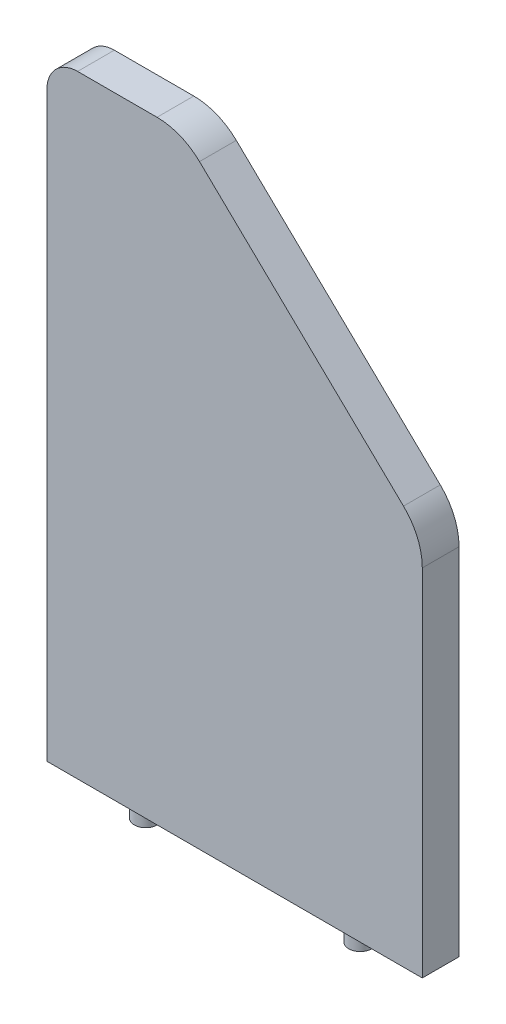
ISO-10303-21;
HEADER;
FILE_DESCRIPTION(('STEP AP214'),'2;1');
FILE_NAME('part.step','',(''),(''),'','','');
FILE_SCHEMA(('AUTOMOTIVE_DESIGN { 1 0 10303 214 1 1 1 1 }'));
ENDSEC;
DATA;
#1=APPLICATION_CONTEXT('core data for automotive mechanical design processes');
#2=APPLICATION_PROTOCOL_DEFINITION('international standard','automotive_design',2000,#1);
#3=PRODUCT_CONTEXT('',#1,'mechanical');
#4=PRODUCT('Part','Part','',(#3));
#5=PRODUCT_RELATED_PRODUCT_CATEGORY('part','',(#4));
#6=PRODUCT_DEFINITION_FORMATION('','',#4);
#7=PRODUCT_DEFINITION_CONTEXT('part definition',#1,'design');
#8=PRODUCT_DEFINITION('design','',#6,#7);
#9=PRODUCT_DEFINITION_SHAPE('','',#8);
#10=(LENGTH_UNIT() NAMED_UNIT(*) SI_UNIT(.MILLI.,.METRE.));
#11=(NAMED_UNIT(*) PLANE_ANGLE_UNIT() SI_UNIT($,.RADIAN.));
#12=(NAMED_UNIT(*) SI_UNIT($,.STERADIAN.) SOLID_ANGLE_UNIT());
#13=UNCERTAINTY_MEASURE_WITH_UNIT(LENGTH_MEASURE(1.E-05),#10,'distance_accuracy_value','');
#14=(GEOMETRIC_REPRESENTATION_CONTEXT(3) GLOBAL_UNCERTAINTY_ASSIGNED_CONTEXT((#13)) GLOBAL_UNIT_ASSIGNED_CONTEXT((#10,
#11,#12)) REPRESENTATION_CONTEXT('',''));
#15=CARTESIAN_POINT('',(0.,0.,0.));
#16=DIRECTION('',(0.,0.,1.));
#17=DIRECTION('',(1.,0.,0.));
#18=AXIS2_PLACEMENT_3D('',#15,#16,#17);
#19=CARTESIAN_POINT('',(0.,0.,12.));
#20=DIRECTION('',(0.,1.,0.));
#21=DIRECTION('',(0.,0.,1.));
#22=AXIS2_PLACEMENT_3D('',#19,#20,#21);
#23=PLANE('',#22);
#24=CARTESIAN_POINT('',(26.25,0.,6.));
#25=DIRECTION('',(0.,1.,0.));
#26=DIRECTION('',(0.,0.,1.));
#27=AXIS2_PLACEMENT_3D('',#24,#25,#26);
#28=CIRCLE('',#27,3.75);
#29=CARTESIAN_POINT('',(26.25,0.,9.75));
#30=VERTEX_POINT('',#29);
#31=EDGE_CURVE('E41',#30,#30,#28,.F.);
#32=ORIENTED_EDGE('',*,*,#31,.F.);
#33=EDGE_LOOP('',(#32));
#34=FACE_BOUND('',#33,.T.);
#35=DIRECTION('',(1.,0.,0.));
#36=VECTOR('',#35,1.);
#37=CARTESIAN_POINT('',(0.,0.,0.));
#38=LINE('',#37,#36);
#39=CARTESIAN_POINT('',(0.,0.,0.));
#40=VERTEX_POINT('',#39);
#41=CARTESIAN_POINT('',(122.5,0.,0.));
#42=VERTEX_POINT('',#41);
#43=EDGE_CURVE('E156',#40,#42,#38,.T.);
#44=ORIENTED_EDGE('',*,*,#43,.T.);
#45=DIRECTION('',(0.,0.,-1.));
#46=VECTOR('',#45,1.);
#47=CARTESIAN_POINT('',(122.5,0.,12.));
#48=LINE('',#47,#46);
#49=CARTESIAN_POINT('',(122.5,0.,12.));
#50=VERTEX_POINT('',#49);
#51=EDGE_CURVE('E154',#50,#42,#48,.T.);
#52=ORIENTED_EDGE('',*,*,#51,.F.);
#53=DIRECTION('',(1.,0.,0.));
#54=VECTOR('',#53,1.);
#55=CARTESIAN_POINT('',(0.,0.,12.));
#56=LINE('',#55,#54);
#57=CARTESIAN_POINT('',(0.,0.,12.));
#58=VERTEX_POINT('',#57);
#59=EDGE_CURVE('E146',#58,#50,#56,.T.);
#60=ORIENTED_EDGE('',*,*,#59,.F.);
#61=DIRECTION('',(0.,0.,-1.));
#62=VECTOR('',#61,1.);
#63=CARTESIAN_POINT('',(0.,0.,12.));
#64=LINE('',#63,#62);
#65=EDGE_CURVE('E164',#58,#40,#64,.T.);
#66=ORIENTED_EDGE('',*,*,#65,.T.);
#67=EDGE_LOOP('',(#44,#52,#60,#66));
#68=FACE_BOUND('',#67,.T.);
#69=CARTESIAN_POINT('',(96.25,0.,6.));
#70=DIRECTION('',(0.,1.,0.));
#71=DIRECTION('',(0.,0.,1.));
#72=AXIS2_PLACEMENT_3D('',#69,#70,#71);
#73=CIRCLE('',#72,3.75000000000001);
#74=CARTESIAN_POINT('',(96.25,0.,9.75000000000001));
#75=VERTEX_POINT('',#74);
#76=EDGE_CURVE('E11',#75,#75,#73,.F.);
#77=ORIENTED_EDGE('',*,*,#76,.F.);
#78=EDGE_LOOP('',(#77));
#79=FACE_BOUND('',#78,.T.);
#80=ADVANCED_FACE('F33',(#34,#68,#79),#23,.F.);
#81=CARTESIAN_POINT('',(0.,0.,12.));
#82=DIRECTION('',(1.,0.,0.));
#83=DIRECTION('',(0.,0.,-1.));
#84=AXIS2_PLACEMENT_3D('',#81,#82,#83);
#85=PLANE('',#84);
#86=CARTESIAN_POINT('',(0.,10.,6.));
#87=DIRECTION('',(-1.,0.,0.));
#88=DIRECTION('',(0.,0.,1.));
#89=AXIS2_PLACEMENT_3D('',#86,#87,#88);
#90=CIRCLE('',#89,2.49999999999999);
#91=CARTESIAN_POINT('',(0.,10.,8.49999999999999));
#92=VERTEX_POINT('',#91);
#93=EDGE_CURVE('E121',#92,#92,#90,.T.);
#94=ORIENTED_EDGE('',*,*,#93,.F.);
#95=EDGE_LOOP('',(#94));
#96=FACE_BOUND('',#95,.T.);
#97=CARTESIAN_POINT('',(0.,180.,6.));
#98=DIRECTION('',(-1.,0.,0.));
#99=DIRECTION('',(0.,0.,1.));
#100=AXIS2_PLACEMENT_3D('',#97,#98,#99);
#101=CIRCLE('',#100,2.5);
#102=CARTESIAN_POINT('',(0.,180.,8.5));
#103=VERTEX_POINT('',#102);
#104=EDGE_CURVE('E120',#103,#103,#101,.T.);
#105=ORIENTED_EDGE('',*,*,#104,.F.);
#106=EDGE_LOOP('',(#105));
#107=FACE_BOUND('',#106,.T.);
#108=DIRECTION('',(0.,-1.,0.));
#109=VECTOR('',#108,1.);
#110=CARTESIAN_POINT('',(0.,0.,12.));
#111=LINE('',#110,#109);
#112=CARTESIAN_POINT('',(0.,190.,12.));
#113=VERTEX_POINT('',#112);
#114=EDGE_CURVE('E144',#113,#58,#111,.T.);
#115=ORIENTED_EDGE('',*,*,#114,.F.);
#116=DIRECTION('',(0.,0.,-1.));
#117=VECTOR('',#116,1.);
#118=CARTESIAN_POINT('',(0.,190.,12.));
#119=LINE('',#118,#117);
#120=CARTESIAN_POINT('',(0.,190.,0.));
#121=VERTEX_POINT('',#120);
#122=EDGE_CURVE('E185',#113,#121,#119,.T.);
#123=ORIENTED_EDGE('',*,*,#122,.T.);
#124=DIRECTION('',(0.,-1.,0.));
#125=VECTOR('',#124,1.);
#126=CARTESIAN_POINT('',(0.,0.,0.));
#127=LINE('',#126,#125);
#128=EDGE_CURVE('E141',#121,#40,#127,.T.);
#129=ORIENTED_EDGE('',*,*,#128,.T.);
#130=ORIENTED_EDGE('',*,*,#65,.F.);
#131=EDGE_LOOP('',(#115,#123,#129,#130));
#132=FACE_BOUND('',#131,.T.);
#133=ADVANCED_FACE('F198',(#96,#107,#132),#85,.F.);
#134=CARTESIAN_POINT('',(122.5,0.,12.));
#135=DIRECTION('',(-1.,0.,0.));
#136=DIRECTION('',(0.,0.,1.));
#137=AXIS2_PLACEMENT_3D('',#134,#135,#136);
#138=PLANE('',#137);
#139=DIRECTION('',(0.,1.,0.));
#140=VECTOR('',#139,1.);
#141=CARTESIAN_POINT('',(122.5,0.,0.));
#142=LINE('',#141,#140);
#143=CARTESIAN_POINT('',(122.5,115.907902457887,0.));
#144=VERTEX_POINT('',#143);
#145=EDGE_CURVE('E158',#42,#144,#142,.T.);
#146=ORIENTED_EDGE('',*,*,#145,.T.);
#147=DIRECTION('',(0.,0.,1.));
#148=VECTOR('',#147,1.);
#149=CARTESIAN_POINT('',(122.5,115.907902457887,12.));
#150=LINE('',#149,#148);
#151=CARTESIAN_POINT('',(122.5,115.907902457887,12.));
#152=VERTEX_POINT('',#151);
#153=EDGE_CURVE('E176',#144,#152,#150,.T.);
#154=ORIENTED_EDGE('',*,*,#153,.T.);
#155=DIRECTION('',(0.,1.,0.));
#156=VECTOR('',#155,1.);
#157=CARTESIAN_POINT('',(122.5,0.,12.));
#158=LINE('',#157,#156);
#159=EDGE_CURVE('E149',#50,#152,#158,.T.);
#160=ORIENTED_EDGE('',*,*,#159,.F.);
#161=ORIENTED_EDGE('',*,*,#51,.T.);
#162=EDGE_LOOP('',(#146,#154,#160,#161));
#163=FACE_BOUND('',#162,.T.);
#164=ADVANCED_FACE('F237',(#163),#138,.F.);
#165=CARTESIAN_POINT('',(0.,200.,12.));
#166=DIRECTION('',(0.,-1.,0.));
#167=DIRECTION('',(0.,0.,-1.));
#168=AXIS2_PLACEMENT_3D('',#165,#166,#167);
#169=PLANE('',#168);
#170=DIRECTION('',(-1.,0.,0.));
#171=VECTOR('',#170,1.);
#172=CARTESIAN_POINT('',(0.,200.,0.));
#173=LINE('',#172,#171);
#174=CARTESIAN_POINT('',(35.9233922790321,200.,0.));
#175=VERTEX_POINT('',#174);
#176=CARTESIAN_POINT('',(10.,200.,0.));
#177=VERTEX_POINT('',#176);
#178=EDGE_CURVE('E147',#175,#177,#173,.T.);
#179=ORIENTED_EDGE('',*,*,#178,.T.);
#180=DIRECTION('',(0.,0.,-1.));
#181=VECTOR('',#180,1.);
#182=CARTESIAN_POINT('',(10.,200.,12.));
#183=LINE('',#182,#181);
#184=CARTESIAN_POINT('',(10.,200.,12.));
#185=VERTEX_POINT('',#184);
#186=EDGE_CURVE('E48',#177,#185,#183,.F.);
#187=ORIENTED_EDGE('',*,*,#186,.T.);
#188=DIRECTION('',(-1.,0.,0.));
#189=VECTOR('',#188,1.);
#190=CARTESIAN_POINT('',(0.,200.,12.));
#191=LINE('',#190,#189);
#192=CARTESIAN_POINT('',(35.9233922790321,200.,12.));
#193=VERTEX_POINT('',#192);
#194=EDGE_CURVE('E152',#193,#185,#191,.T.);
#195=ORIENTED_EDGE('',*,*,#194,.F.);
#196=DIRECTION('',(0.,0.,1.));
#197=VECTOR('',#196,1.);
#198=CARTESIAN_POINT('',(35.9233922790321,200.,12.));
#199=LINE('',#198,#197);
#200=EDGE_CURVE('E172',#193,#175,#199,.F.);
#201=ORIENTED_EDGE('',*,*,#200,.T.);
#202=EDGE_LOOP('',(#179,#187,#195,#201));
#203=FACE_BOUND('',#202,.T.);
#204=ADVANCED_FACE('F231',(#203),#169,.F.);
#205=CARTESIAN_POINT('',(0.,0.,12.));
#206=DIRECTION('',(0.,0.,-1.));
#207=DIRECTION('',(-1.,0.,0.));
#208=AXIS2_PLACEMENT_3D('',#205,#206,#207);
#209=PLANE('',#208);
#210=ORIENTED_EDGE('',*,*,#194,.T.);
#211=CARTESIAN_POINT('',(10.,190.,12.));
#212=DIRECTION('',(0.,0.,-1.));
#213=DIRECTION('',(-1.,0.,0.));
#214=AXIS2_PLACEMENT_3D('',#211,#212,#213);
#215=CIRCLE('',#214,10.);
#216=EDGE_CURVE('E190',#185,#113,#215,.F.);
#217=ORIENTED_EDGE('',*,*,#216,.T.);
#218=ORIENTED_EDGE('',*,*,#114,.T.);
#219=ORIENTED_EDGE('',*,*,#59,.T.);
#220=ORIENTED_EDGE('',*,*,#159,.T.);
#221=CARTESIAN_POINT('',(102.5,115.907902457887,12.));
#222=DIRECTION('',(0.,0.,-1.));
#223=DIRECTION('',(-1.,0.,0.));
#224=AXIS2_PLACEMENT_3D('',#221,#222,#223);
#225=CIRCLE('',#224,20.);
#226=CARTESIAN_POINT('',(116.370732635551,130.316329719496,12.));
#227=VERTEX_POINT('',#226);
#228=EDGE_CURVE('E179',#152,#227,#225,.F.);
#229=ORIENTED_EDGE('',*,*,#228,.T.);
#230=DIRECTION('',(0.720421363080441,-0.693536631777528,0.));
#231=VECTOR('',#230,1.);
#232=CARTESIAN_POINT('',(43.9857966023049,200.,12.));
#233=LINE('',#232,#231);
#234=CARTESIAN_POINT('',(49.7941249145827,194.408427261609,12.));
#235=VERTEX_POINT('',#234);
#236=EDGE_CURVE('E137',#235,#227,#233,.T.);
#237=ORIENTED_EDGE('',*,*,#236,.F.);
#238=CARTESIAN_POINT('',(35.9233922790321,180.,12.));
#239=DIRECTION('',(0.,0.,-1.));
#240=DIRECTION('',(-1.,0.,0.));
#241=AXIS2_PLACEMENT_3D('',#238,#239,#240);
#242=CIRCLE('',#241,20.);
#243=EDGE_CURVE('E170',#235,#193,#242,.F.);
#244=ORIENTED_EDGE('',*,*,#243,.T.);
#245=EDGE_LOOP('',(#210,#217,#218,#219,#220,#229,#237,#244));
#246=FACE_BOUND('',#245,.T.);
#247=ADVANCED_FACE('F228',(#246),#209,.F.);
#248=CARTESIAN_POINT('',(0.,0.,0.));
#249=DIRECTION('',(0.,0.,-1.));
#250=DIRECTION('',(-1.,0.,0.));
#251=AXIS2_PLACEMENT_3D('',#248,#249,#250);
#252=PLANE('',#251);
#253=ORIENTED_EDGE('',*,*,#128,.F.);
#254=CARTESIAN_POINT('',(10.,190.,0.));
#255=DIRECTION('',(0.,0.,-1.));
#256=DIRECTION('',(-1.,0.,0.));
#257=AXIS2_PLACEMENT_3D('',#254,#255,#256);
#258=CIRCLE('',#257,10.);
#259=EDGE_CURVE('E56',#121,#177,#258,.T.);
#260=ORIENTED_EDGE('',*,*,#259,.T.);
#261=ORIENTED_EDGE('',*,*,#178,.F.);
#262=CARTESIAN_POINT('',(35.9233922790321,180.,0.));
#263=DIRECTION('',(0.,0.,-1.));
#264=DIRECTION('',(-1.,0.,0.));
#265=AXIS2_PLACEMENT_3D('',#262,#263,#264);
#266=CIRCLE('',#265,20.);
#267=CARTESIAN_POINT('',(49.7941249145827,194.408427261609,0.));
#268=VERTEX_POINT('',#267);
#269=EDGE_CURVE('E174',#175,#268,#266,.T.);
#270=ORIENTED_EDGE('',*,*,#269,.T.);
#271=DIRECTION('',(0.720421363080441,-0.693536631777528,0.));
#272=VECTOR('',#271,1.);
#273=CARTESIAN_POINT('',(43.9857966023049,200.,0.));
#274=LINE('',#273,#272);
#275=CARTESIAN_POINT('',(116.370732635551,130.316329719496,0.));
#276=VERTEX_POINT('',#275);
#277=EDGE_CURVE('E138',#268,#276,#274,.T.);
#278=ORIENTED_EDGE('',*,*,#277,.T.);
#279=CARTESIAN_POINT('',(102.5,115.907902457887,0.));
#280=DIRECTION('',(0.,0.,-1.));
#281=DIRECTION('',(-1.,0.,0.));
#282=AXIS2_PLACEMENT_3D('',#279,#280,#281);
#283=CIRCLE('',#282,20.);
#284=EDGE_CURVE('E183',#276,#144,#283,.T.);
#285=ORIENTED_EDGE('',*,*,#284,.T.);
#286=ORIENTED_EDGE('',*,*,#145,.F.);
#287=ORIENTED_EDGE('',*,*,#43,.F.);
#288=EDGE_LOOP('',(#253,#260,#261,#270,#278,#285,#286,#287));
#289=FACE_BOUND('',#288,.T.);
#290=ADVANCED_FACE('F226',(#289),#252,.T.);
#291=CARTESIAN_POINT('',(43.9857966023049,200.,0.));
#292=DIRECTION('',(-0.693536631777528,-0.720421363080441,0.));
#293=DIRECTION('',(0.720421363080441,-0.693536631777528,0.));
#294=AXIS2_PLACEMENT_3D('',#291,#292,#293);
#295=PLANE('',#294);
#296=ORIENTED_EDGE('',*,*,#236,.T.);
#297=DIRECTION('',(0.,0.,1.));
#298=VECTOR('',#297,1.);
#299=CARTESIAN_POINT('',(116.370732635551,130.316329719496,0.));
#300=LINE('',#299,#298);
#301=EDGE_CURVE('E181',#227,#276,#300,.F.);
#302=ORIENTED_EDGE('',*,*,#301,.T.);
#303=ORIENTED_EDGE('',*,*,#277,.F.);
#304=DIRECTION('',(0.,0.,1.));
#305=VECTOR('',#304,1.);
#306=CARTESIAN_POINT('',(49.7941249145827,194.408427261609,0.));
#307=LINE('',#306,#305);
#308=EDGE_CURVE('E167',#268,#235,#307,.T.);
#309=ORIENTED_EDGE('',*,*,#308,.T.);
#310=EDGE_LOOP('',(#296,#302,#303,#309));
#311=FACE_BOUND('',#310,.T.);
#312=ADVANCED_FACE('F222',(#311),#295,.F.);
#313=CARTESIAN_POINT('',(35.9233922790321,180.,0.));
#314=DIRECTION('',(0.,0.,1.));
#315=DIRECTION('',(1.,0.,0.));
#316=AXIS2_PLACEMENT_3D('',#313,#314,#315);
#317=CYLINDRICAL_SURFACE('',#316,20.);
#318=ORIENTED_EDGE('',*,*,#269,.F.);
#319=ORIENTED_EDGE('',*,*,#200,.F.);
#320=ORIENTED_EDGE('',*,*,#243,.F.);
#321=ORIENTED_EDGE('',*,*,#308,.F.);
#322=EDGE_LOOP('',(#318,#319,#320,#321));
#323=FACE_BOUND('',#322,.T.);
#324=ADVANCED_FACE('F225',(#323),#317,.T.);
#325=CARTESIAN_POINT('',(102.5,115.907902457887,12.));
#326=DIRECTION('',(0.,0.,1.));
#327=DIRECTION('',(1.,0.,0.));
#328=AXIS2_PLACEMENT_3D('',#325,#326,#327);
#329=CYLINDRICAL_SURFACE('',#328,20.);
#330=ORIENTED_EDGE('',*,*,#284,.F.);
#331=ORIENTED_EDGE('',*,*,#301,.F.);
#332=ORIENTED_EDGE('',*,*,#228,.F.);
#333=ORIENTED_EDGE('',*,*,#153,.F.);
#334=EDGE_LOOP('',(#330,#331,#332,#333));
#335=FACE_BOUND('',#334,.T.);
#336=ADVANCED_FACE('F245',(#335),#329,.T.);
#337=CARTESIAN_POINT('',(10.,190.,12.));
#338=DIRECTION('',(0.,0.,-1.));
#339=DIRECTION('',(-1.,0.,0.));
#340=AXIS2_PLACEMENT_3D('',#337,#338,#339);
#341=CYLINDRICAL_SURFACE('',#340,10.);
#342=ORIENTED_EDGE('',*,*,#216,.F.);
#343=ORIENTED_EDGE('',*,*,#186,.F.);
#344=ORIENTED_EDGE('',*,*,#259,.F.);
#345=ORIENTED_EDGE('',*,*,#122,.F.);
#346=EDGE_LOOP('',(#342,#343,#344,#345));
#347=FACE_BOUND('',#346,.T.);
#348=ADVANCED_FACE('F35',(#347),#341,.T.);
#349=CARTESIAN_POINT('',(26.25,-6.,6.));
#350=DIRECTION('',(0.,1.,0.));
#351=DIRECTION('',(0.,0.,1.));
#352=AXIS2_PLACEMENT_3D('',#349,#350,#351);
#353=CYLINDRICAL_SURFACE('',#352,3.75);
#354=CARTESIAN_POINT('',(26.25,-6.,6.));
#355=DIRECTION('',(0.,-1.,0.));
#356=DIRECTION('',(0.,0.,-1.));
#357=AXIS2_PLACEMENT_3D('',#354,#355,#356);
#358=CIRCLE('',#357,3.75);
#359=CARTESIAN_POINT('',(26.25,-6.,2.25));
#360=VERTEX_POINT('',#359);
#361=EDGE_CURVE('E134',#360,#360,#358,.T.);
#362=ORIENTED_EDGE('',*,*,#361,.F.);
#363=EDGE_LOOP('',(#362));
#364=FACE_BOUND('',#363,.T.);
#365=ORIENTED_EDGE('',*,*,#31,.T.);
#366=EDGE_LOOP('',(#365));
#367=FACE_BOUND('',#366,.T.);
#368=ADVANCED_FACE('F194',(#364,#367),#353,.T.);
#369=CARTESIAN_POINT('',(96.25,-6.,6.));
#370=DIRECTION('',(0.,1.,0.));
#371=DIRECTION('',(0.,0.,1.));
#372=AXIS2_PLACEMENT_3D('',#369,#370,#371);
#373=CYLINDRICAL_SURFACE('',#372,3.75000000000001);
#374=CARTESIAN_POINT('',(96.25,-6.,6.));
#375=DIRECTION('',(0.,-1.,0.));
#376=DIRECTION('',(0.,0.,-1.));
#377=AXIS2_PLACEMENT_3D('',#374,#375,#376);
#378=CIRCLE('',#377,3.75000000000001);
#379=CARTESIAN_POINT('',(96.25,-6.,2.24999999999999));
#380=VERTEX_POINT('',#379);
#381=EDGE_CURVE('E131',#380,#380,#378,.T.);
#382=ORIENTED_EDGE('',*,*,#381,.F.);
#383=EDGE_LOOP('',(#382));
#384=FACE_BOUND('',#383,.T.);
#385=ORIENTED_EDGE('',*,*,#76,.T.);
#386=EDGE_LOOP('',(#385));
#387=FACE_BOUND('',#386,.T.);
#388=ADVANCED_FACE('F205',(#384,#387),#373,.T.);
#389=CARTESIAN_POINT('',(26.25,-6.,6.));
#390=DIRECTION('',(0.,1.,0.));
#391=DIRECTION('',(0.,0.,-1.));
#392=AXIS2_PLACEMENT_3D('',#389,#390,#391);
#393=CONICAL_SURFACE('',#392,3.75,1.08210413623649);
#394=CARTESIAN_POINT('',(26.25,-7.99391036873054,6.));
#395=VERTEX_POINT('',#394);
#396=VERTEX_LOOP('',#395);
#397=FACE_BOUND('',#396,.T.);
#398=ORIENTED_EDGE('',*,*,#361,.T.);
#399=EDGE_LOOP('',(#398));
#400=FACE_BOUND('',#399,.T.);
#401=ADVANCED_FACE('F207',(#397,#400),#393,.T.);
#402=CARTESIAN_POINT('',(96.25,-6.,6.));
#403=DIRECTION('',(0.,1.,0.));
#404=DIRECTION('',(0.,0.,-1.));
#405=AXIS2_PLACEMENT_3D('',#402,#403,#404);
#406=CONICAL_SURFACE('',#405,3.75000000000001,1.08210413623649);
#407=CARTESIAN_POINT('',(96.25,-7.99391036873054,6.));
#408=VERTEX_POINT('',#407);
#409=VERTEX_LOOP('',#408);
#410=FACE_BOUND('',#409,.T.);
#411=ORIENTED_EDGE('',*,*,#381,.T.);
#412=EDGE_LOOP('',(#411));
#413=FACE_BOUND('',#412,.T.);
#414=ADVANCED_FACE('F214',(#410,#413),#406,.T.);
#415=CARTESIAN_POINT('',(8.00000000000001,180.,6.));
#416=DIRECTION('',(-1.,0.,0.));
#417=DIRECTION('',(0.,0.,1.));
#418=AXIS2_PLACEMENT_3D('',#415,#416,#417);
#419=CONICAL_SURFACE('',#418,2.49999999999997,1.02974425867665);
#420=CARTESIAN_POINT('',(9.50215154756891,180.,6.));
#421=VERTEX_POINT('',#420);
#422=VERTEX_LOOP('',#421);
#423=FACE_BOUND('',#422,.T.);
#424=CARTESIAN_POINT('',(8.00000000000001,180.,6.));
#425=DIRECTION('',(-1.,0.,0.));
#426=DIRECTION('',(0.,0.,1.));
#427=AXIS2_PLACEMENT_3D('',#424,#425,#426);
#428=CIRCLE('',#427,2.49999999999997);
#429=CARTESIAN_POINT('',(8.00000000000001,180.,8.49999999999998));
#430=VERTEX_POINT('',#429);
#431=EDGE_CURVE('E124',#430,#430,#428,.T.);
#432=ORIENTED_EDGE('',*,*,#431,.T.);
#433=EDGE_LOOP('',(#432));
#434=FACE_BOUND('',#433,.T.);
#435=ADVANCED_FACE('F298',(#423,#434),#419,.F.);
#436=CARTESIAN_POINT('',(0.,180.,6.));
#437=DIRECTION('',(-1.,0.,0.));
#438=DIRECTION('',(0.,0.,1.));
#439=AXIS2_PLACEMENT_3D('',#436,#437,#438);
#440=CYLINDRICAL_SURFACE('',#439,2.49999999999999);
#441=ORIENTED_EDGE('',*,*,#431,.F.);
#442=EDGE_LOOP('',(#441));
#443=FACE_BOUND('',#442,.T.);
#444=ORIENTED_EDGE('',*,*,#104,.T.);
#445=EDGE_LOOP('',(#444));
#446=FACE_BOUND('',#445,.T.);
#447=ADVANCED_FACE('F114',(#443,#446),#440,.F.);
#448=CARTESIAN_POINT('',(7.99999999999999,10.,6.));
#449=DIRECTION('',(-1.,0.,0.));
#450=DIRECTION('',(0.,0.,1.));
#451=AXIS2_PLACEMENT_3D('',#448,#449,#450);
#452=CONICAL_SURFACE('',#451,2.49999999999999,1.02974425867665);
#453=CARTESIAN_POINT('',(9.5021515475689,10.,6.));
#454=VERTEX_POINT('',#453);
#455=VERTEX_LOOP('',#454);
#456=FACE_BOUND('',#455,.T.);
#457=CARTESIAN_POINT('',(7.99999999999999,10.,6.));
#458=DIRECTION('',(-1.,0.,0.));
#459=DIRECTION('',(0.,0.,1.));
#460=AXIS2_PLACEMENT_3D('',#457,#458,#459);
#461=CIRCLE('',#460,2.49999999999999);
#462=CARTESIAN_POINT('',(7.99999999999999,10.,8.49999999999999));
#463=VERTEX_POINT('',#462);
#464=EDGE_CURVE('E118',#463,#463,#461,.T.);
#465=ORIENTED_EDGE('',*,*,#464,.T.);
#466=EDGE_LOOP('',(#465));
#467=FACE_BOUND('',#466,.T.);
#468=ADVANCED_FACE('F110',(#456,#467),#452,.F.);
#469=CARTESIAN_POINT('',(0.,10.,6.));
#470=DIRECTION('',(-1.,0.,0.));
#471=DIRECTION('',(0.,0.,1.));
#472=AXIS2_PLACEMENT_3D('',#469,#470,#471);
#473=CYLINDRICAL_SURFACE('',#472,2.49999999999999);
#474=ORIENTED_EDGE('',*,*,#464,.F.);
#475=EDGE_LOOP('',(#474));
#476=FACE_BOUND('',#475,.T.);
#477=ORIENTED_EDGE('',*,*,#93,.T.);
#478=EDGE_LOOP('',(#477));
#479=FACE_BOUND('',#478,.T.);
#480=ADVANCED_FACE('F113',(#476,#479),#473,.F.);
#481=CLOSED_SHELL('',(#80,#133,#164,#204,#247,#290,#312,#324,#336,#348,#368,#388,#401,#414,#435,
#447,#468,#480));
#482=MANIFOLD_SOLID_BREP('B2',#481);
#483=ADVANCED_BREP_SHAPE_REPRESENTATION('',(#18,#482),#14);
#484=SHAPE_DEFINITION_REPRESENTATION(#9,#483);
ENDSEC;
END-ISO-10303-21;
